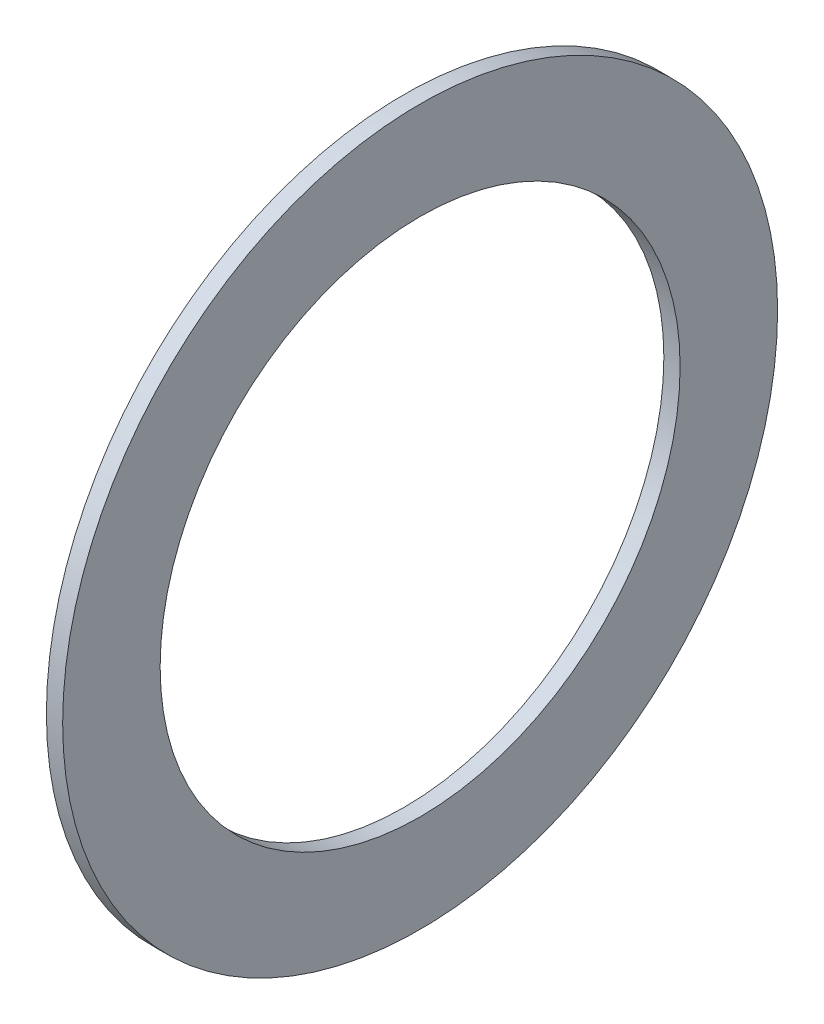
ISO-10303-21;
HEADER;
FILE_DESCRIPTION(('STEP AP214'),'2;1');
FILE_NAME('part.step','',(''),(''),'','','');
FILE_SCHEMA(('AUTOMOTIVE_DESIGN { 1 0 10303 214 1 1 1 1 }'));
ENDSEC;
DATA;
#1=APPLICATION_CONTEXT('core data for automotive mechanical design processes');
#2=APPLICATION_PROTOCOL_DEFINITION('international standard','automotive_design',2000,#1);
#3=PRODUCT_CONTEXT('',#1,'mechanical');
#4=PRODUCT('Part','Part','',(#3));
#5=PRODUCT_RELATED_PRODUCT_CATEGORY('part','',(#4));
#6=PRODUCT_DEFINITION_FORMATION('','',#4);
#7=PRODUCT_DEFINITION_CONTEXT('part definition',#1,'design');
#8=PRODUCT_DEFINITION('design','',#6,#7);
#9=PRODUCT_DEFINITION_SHAPE('','',#8);
#10=(LENGTH_UNIT() NAMED_UNIT(*) SI_UNIT(.MILLI.,.METRE.));
#11=(NAMED_UNIT(*) PLANE_ANGLE_UNIT() SI_UNIT($,.RADIAN.));
#12=(NAMED_UNIT(*) SI_UNIT($,.STERADIAN.) SOLID_ANGLE_UNIT());
#13=UNCERTAINTY_MEASURE_WITH_UNIT(LENGTH_MEASURE(1.E-05),#10,'distance_accuracy_value','');
#14=(GEOMETRIC_REPRESENTATION_CONTEXT(3) GLOBAL_UNCERTAINTY_ASSIGNED_CONTEXT((#13)) GLOBAL_UNIT_ASSIGNED_CONTEXT((#10,
#11,#12)) REPRESENTATION_CONTEXT('',''));
#15=CARTESIAN_POINT('',(0.,0.,0.));
#16=DIRECTION('',(0.,0.,1.));
#17=DIRECTION('',(1.,0.,0.));
#18=AXIS2_PLACEMENT_3D('',#15,#16,#17);
#19=CARTESIAN_POINT('',(0.25,0.,0.));
#20=DIRECTION('',(1.,0.,0.));
#21=DIRECTION('',(0.,0.,-1.));
#22=AXIS2_PLACEMENT_3D('',#19,#20,#21);
#23=PLANE('',#22);
#24=CARTESIAN_POINT('',(0.25,0.,0.));
#25=DIRECTION('',(1.,0.,0.));
#26=DIRECTION('',(0.,0.,-1.));
#27=AXIS2_PLACEMENT_3D('',#24,#25,#26);
#28=CIRCLE('',#27,5.5);
#29=CARTESIAN_POINT('',(0.25,0.,-5.5));
#30=VERTEX_POINT('',#29);
#31=EDGE_CURVE('E10',#30,#30,#28,.T.);
#32=ORIENTED_EDGE('',*,*,#31,.T.);
#33=EDGE_LOOP('',(#32));
#34=FACE_BOUND('',#33,.T.);
#35=CARTESIAN_POINT('',(0.25,0.,0.));
#36=DIRECTION('',(1.,0.,0.));
#37=DIRECTION('',(0.,0.,-1.));
#38=AXIS2_PLACEMENT_3D('',#35,#36,#37);
#39=CIRCLE('',#38,4.);
#40=CARTESIAN_POINT('',(0.25,0.,-4.));
#41=VERTEX_POINT('',#40);
#42=EDGE_CURVE('E48',#41,#41,#39,.T.);
#43=ORIENTED_EDGE('',*,*,#42,.F.);
#44=EDGE_LOOP('',(#43));
#45=FACE_BOUND('',#44,.T.);
#46=ADVANCED_FACE('F37',(#34,#45),#23,.T.);
#47=CARTESIAN_POINT('',(0.,0.,0.));
#48=DIRECTION('',(1.,0.,0.));
#49=DIRECTION('',(0.,0.,-1.));
#50=AXIS2_PLACEMENT_3D('',#47,#48,#49);
#51=PLANE('',#50);
#52=CARTESIAN_POINT('',(0.,0.,0.));
#53=DIRECTION('',(1.,0.,0.));
#54=DIRECTION('',(0.,0.,-1.));
#55=AXIS2_PLACEMENT_3D('',#52,#53,#54);
#56=CIRCLE('',#55,5.5);
#57=CARTESIAN_POINT('',(0.,0.,-5.5));
#58=VERTEX_POINT('',#57);
#59=EDGE_CURVE('E41',#58,#58,#56,.T.);
#60=ORIENTED_EDGE('',*,*,#59,.F.);
#61=EDGE_LOOP('',(#60));
#62=FACE_BOUND('',#61,.T.);
#63=CARTESIAN_POINT('',(0.,0.,0.));
#64=DIRECTION('',(1.,0.,0.));
#65=DIRECTION('',(0.,0.,-1.));
#66=AXIS2_PLACEMENT_3D('',#63,#64,#65);
#67=CIRCLE('',#66,4.);
#68=CARTESIAN_POINT('',(0.,0.,-4.));
#69=VERTEX_POINT('',#68);
#70=EDGE_CURVE('E50',#69,#69,#67,.T.);
#71=ORIENTED_EDGE('',*,*,#70,.T.);
#72=EDGE_LOOP('',(#71));
#73=FACE_BOUND('',#72,.T.);
#74=ADVANCED_FACE('F60',(#62,#73),#51,.F.);
#75=CARTESIAN_POINT('',(0.25,0.,0.));
#76=DIRECTION('',(-1.,0.,0.));
#77=DIRECTION('',(0.,0.,1.));
#78=AXIS2_PLACEMENT_3D('',#75,#76,#77);
#79=CYLINDRICAL_SURFACE('',#78,5.5);
#80=ORIENTED_EDGE('',*,*,#31,.F.);
#81=EDGE_LOOP('',(#80));
#82=FACE_BOUND('',#81,.T.);
#83=ORIENTED_EDGE('',*,*,#59,.T.);
#84=EDGE_LOOP('',(#83));
#85=FACE_BOUND('',#84,.T.);
#86=ADVANCED_FACE('F39',(#82,#85),#79,.T.);
#87=CARTESIAN_POINT('',(0.25,0.,0.));
#88=DIRECTION('',(-1.,0.,0.));
#89=DIRECTION('',(0.,0.,1.));
#90=AXIS2_PLACEMENT_3D('',#87,#88,#89);
#91=CYLINDRICAL_SURFACE('',#90,4.);
#92=ORIENTED_EDGE('',*,*,#42,.T.);
#93=EDGE_LOOP('',(#92));
#94=FACE_BOUND('',#93,.T.);
#95=ORIENTED_EDGE('',*,*,#70,.F.);
#96=EDGE_LOOP('',(#95));
#97=FACE_BOUND('',#96,.T.);
#98=ADVANCED_FACE('F56',(#94,#97),#91,.F.);
#99=CLOSED_SHELL('',(#46,#74,#86,#98));
#100=MANIFOLD_SOLID_BREP('B2',#99);
#101=ADVANCED_BREP_SHAPE_REPRESENTATION('',(#18,#100),#14);
#102=SHAPE_DEFINITION_REPRESENTATION(#9,#101);
ENDSEC;
END-ISO-10303-21;
